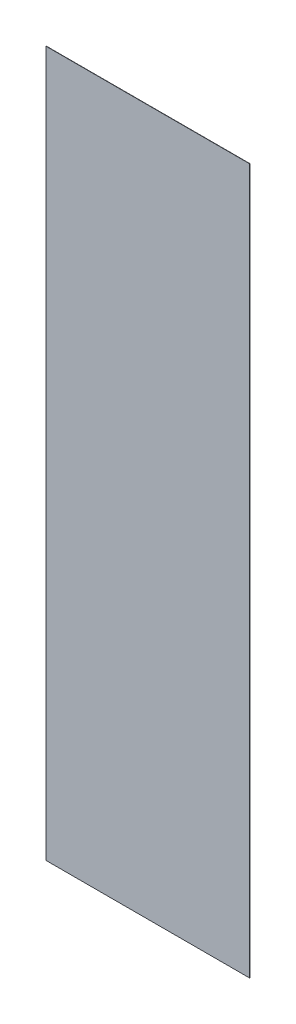
ISO-10303-21;
HEADER;
FILE_DESCRIPTION(('STEP AP214'),'2;1');
FILE_NAME('part.step','',(''),(''),'','','');
FILE_SCHEMA(('AUTOMOTIVE_DESIGN { 1 0 10303 214 1 1 1 1 }'));
ENDSEC;
DATA;
#1=APPLICATION_CONTEXT('core data for automotive mechanical design processes');
#2=APPLICATION_PROTOCOL_DEFINITION('international standard','automotive_design',2000,#1);
#3=PRODUCT_CONTEXT('',#1,'mechanical');
#4=PRODUCT('Part','Part','',(#3));
#5=PRODUCT_RELATED_PRODUCT_CATEGORY('part','',(#4));
#6=PRODUCT_DEFINITION_FORMATION('','',#4);
#7=PRODUCT_DEFINITION_CONTEXT('part definition',#1,'design');
#8=PRODUCT_DEFINITION('design','',#6,#7);
#9=PRODUCT_DEFINITION_SHAPE('','',#8);
#10=(LENGTH_UNIT() NAMED_UNIT(*) SI_UNIT(.MILLI.,.METRE.));
#11=(NAMED_UNIT(*) PLANE_ANGLE_UNIT() SI_UNIT($,.RADIAN.));
#12=(NAMED_UNIT(*) SI_UNIT($,.STERADIAN.) SOLID_ANGLE_UNIT());
#13=UNCERTAINTY_MEASURE_WITH_UNIT(LENGTH_MEASURE(1.E-05),#10,'distance_accuracy_value','');
#14=(GEOMETRIC_REPRESENTATION_CONTEXT(3) GLOBAL_UNCERTAINTY_ASSIGNED_CONTEXT((#13)) GLOBAL_UNIT_ASSIGNED_CONTEXT((#10,
#11,#12)) REPRESENTATION_CONTEXT('',''));
#15=CARTESIAN_POINT('',(0.,0.,0.));
#16=DIRECTION('',(0.,0.,1.));
#17=DIRECTION('',(1.,0.,0.));
#18=AXIS2_PLACEMENT_3D('',#15,#16,#17);
#19=CARTESIAN_POINT('',(693.76,-4810.,0.));
#20=DIRECTION('',(0.866025403784456,0.,0.499999999999969));
#21=DIRECTION('',(0.499999999999969,0.,-0.866025403784456));
#22=AXIS2_PLACEMENT_3D('',#19,#20,#21);
#23=PLANE('',#22);
#24=DIRECTION('',(0.,1.,0.));
#25=VECTOR('',#24,1.);
#26=CARTESIAN_POINT('',(694.33735026919,-4810.,-0.99999999999983));
#27=LINE('',#26,#25);
#28=CARTESIAN_POINT('',(694.33735026919,-4810.,-0.99999999999983));
#29=VERTEX_POINT('',#28);
#30=CARTESIAN_POINT('',(694.33735026919,0.,-0.99999999999983));
#31=VERTEX_POINT('',#30);
#32=EDGE_CURVE('E78',#29,#31,#27,.T.);
#33=ORIENTED_EDGE('',*,*,#32,.T.);
#34=DIRECTION('',(0.377964473009057,0.654653670708317,-0.654653670707736));
#35=VECTOR('',#34,1.);
#36=CARTESIAN_POINT('',(-496.1589047999,-2062.00000000214,2061.00000000031));
#37=LINE('',#36,#35);
#38=CARTESIAN_POINT('',(693.76,-1.00000000000033,0.));
#39=VERTEX_POINT('',#38);
#40=EDGE_CURVE('E61',#31,#39,#37,.F.);
#41=ORIENTED_EDGE('',*,*,#40,.T.);
#42=DIRECTION('',(0.,1.,0.));
#43=VECTOR('',#42,1.);
#44=CARTESIAN_POINT('',(693.76,-4810.,0.));
#45=LINE('',#44,#43);
#46=CARTESIAN_POINT('',(693.76,-4810.,0.));
#47=VERTEX_POINT('',#46);
#48=EDGE_CURVE('E99',#47,#39,#45,.T.);
#49=ORIENTED_EDGE('',*,*,#48,.F.);
#50=DIRECTION('',(0.499999999999969,0.,-0.866025403784456));
#51=VECTOR('',#50,1.);
#52=CARTESIAN_POINT('',(693.76,-4810.,0.));
#53=LINE('',#52,#51);
#54=EDGE_CURVE('E94',#47,#29,#53,.T.);
#55=ORIENTED_EDGE('',*,*,#54,.T.);
#56=EDGE_LOOP('',(#33,#41,#49,#55));
#57=FACE_BOUND('',#56,.T.);
#58=ADVANCED_FACE('F38',(#57),#23,.T.);
#59=CARTESIAN_POINT('',(-693.76,-4810.,0.));
#60=DIRECTION('',(0.,0.,1.));
#61=DIRECTION('',(1.,0.,0.));
#62=AXIS2_PLACEMENT_3D('',#59,#60,#61);
#63=PLANE('',#62);
#64=ORIENTED_EDGE('',*,*,#48,.T.);
#65=DIRECTION('',(-1.,0.,0.));
#66=VECTOR('',#65,1.);
#67=CARTESIAN_POINT('',(-693.76,-1.00000000000033,0.));
#68=LINE('',#67,#66);
#69=CARTESIAN_POINT('',(-693.76,-1.00000000000033,0.));
#70=VERTEX_POINT('',#69);
#71=EDGE_CURVE('E47',#39,#70,#68,.T.);
#72=ORIENTED_EDGE('',*,*,#71,.T.);
#73=DIRECTION('',(0.,1.,0.));
#74=VECTOR('',#73,1.);
#75=CARTESIAN_POINT('',(-693.76,-4810.,0.));
#76=LINE('',#75,#74);
#77=CARTESIAN_POINT('',(-693.76,-4810.,0.));
#78=VERTEX_POINT('',#77);
#79=EDGE_CURVE('E106',#78,#70,#76,.T.);
#80=ORIENTED_EDGE('',*,*,#79,.F.);
#81=DIRECTION('',(1.,0.,0.));
#82=VECTOR('',#81,1.);
#83=CARTESIAN_POINT('',(-693.76,-4810.,0.));
#84=LINE('',#83,#82);
#85=EDGE_CURVE('E87',#78,#47,#84,.T.);
#86=ORIENTED_EDGE('',*,*,#85,.T.);
#87=EDGE_LOOP('',(#64,#72,#80,#86));
#88=FACE_BOUND('',#87,.T.);
#89=ADVANCED_FACE('F113',(#88),#63,.T.);
#90=CARTESIAN_POINT('',(-693.76,-4810.,0.));
#91=DIRECTION('',(-0.866025403784456,0.,0.499999999999969));
#92=DIRECTION('',(0.499999999999969,0.,0.866025403784456));
#93=AXIS2_PLACEMENT_3D('',#90,#91,#92);
#94=PLANE('',#93);
#95=ORIENTED_EDGE('',*,*,#79,.T.);
#96=DIRECTION('',(0.377964473009057,-0.654653670708317,0.654653670707736));
#97=VECTOR('',#96,1.);
#98=CARTESIAN_POINT('',(496.1589047999,-2062.00000000214,2061.00000000031));
#99=LINE('',#98,#97);
#100=CARTESIAN_POINT('',(-694.33735026919,0.,-0.99999999999983));
#101=VERTEX_POINT('',#100);
#102=EDGE_CURVE('E11',#70,#101,#99,.F.);
#103=ORIENTED_EDGE('',*,*,#102,.T.);
#104=DIRECTION('',(0.,1.,0.));
#105=VECTOR('',#104,1.);
#106=CARTESIAN_POINT('',(-694.33735026919,-4810.,-0.99999999999983));
#107=LINE('',#106,#105);
#108=CARTESIAN_POINT('',(-694.33735026919,-4810.,-0.99999999999983));
#109=VERTEX_POINT('',#108);
#110=EDGE_CURVE('E86',#109,#101,#107,.T.);
#111=ORIENTED_EDGE('',*,*,#110,.F.);
#112=DIRECTION('',(0.499999999999969,0.,0.866025403784456));
#113=VECTOR('',#112,1.);
#114=CARTESIAN_POINT('',(-693.76,-4810.,0.));
#115=LINE('',#114,#113);
#116=EDGE_CURVE('E97',#109,#78,#115,.T.);
#117=ORIENTED_EDGE('',*,*,#116,.T.);
#118=EDGE_LOOP('',(#95,#103,#111,#117));
#119=FACE_BOUND('',#118,.T.);
#120=ADVANCED_FACE('F112',(#119),#94,.T.);
#121=CARTESIAN_POINT('',(694.33735026919,-4810.,-0.99999999999983));
#122=DIRECTION('',(0.,0.,-1.));
#123=DIRECTION('',(-1.,0.,0.));
#124=AXIS2_PLACEMENT_3D('',#121,#122,#123);
#125=PLANE('',#124);
#126=DIRECTION('',(-1.,0.,0.));
#127=VECTOR('',#126,1.);
#128=CARTESIAN_POINT('',(694.33735026919,0.,-0.99999999999983));
#129=LINE('',#128,#127);
#130=EDGE_CURVE('E84',#31,#101,#129,.T.);
#131=ORIENTED_EDGE('',*,*,#130,.F.);
#132=ORIENTED_EDGE('',*,*,#32,.F.);
#133=DIRECTION('',(-1.,0.,0.));
#134=VECTOR('',#133,1.);
#135=CARTESIAN_POINT('',(694.33735026919,-4810.,-0.99999999999983));
#136=LINE('',#135,#134);
#137=EDGE_CURVE('E82',#29,#109,#136,.T.);
#138=ORIENTED_EDGE('',*,*,#137,.T.);
#139=ORIENTED_EDGE('',*,*,#110,.T.);
#140=EDGE_LOOP('',(#131,#132,#138,#139));
#141=FACE_BOUND('',#140,.T.);
#142=ADVANCED_FACE('F80',(#141),#125,.T.);
#143=CARTESIAN_POINT('',(0.,-4810.,0.));
#144=DIRECTION('',(0.,1.,0.));
#145=DIRECTION('',(0.,0.,1.));
#146=AXIS2_PLACEMENT_3D('',#143,#144,#145);
#147=PLANE('',#146);
#148=ORIENTED_EDGE('',*,*,#54,.F.);
#149=ORIENTED_EDGE('',*,*,#85,.F.);
#150=ORIENTED_EDGE('',*,*,#116,.F.);
#151=ORIENTED_EDGE('',*,*,#137,.F.);
#152=EDGE_LOOP('',(#148,#149,#150,#151));
#153=FACE_BOUND('',#152,.T.);
#154=ADVANCED_FACE('F92',(#153),#147,.F.);
#155=CARTESIAN_POINT('',(0.,0.,-0.999999999999446));
#156=DIRECTION('',(0.,-0.707106781186233,-0.707106781186862));
#157=DIRECTION('',(1.,0.,0.));
#158=AXIS2_PLACEMENT_3D('',#155,#156,#157);
#159=PLANE('',#158);
#160=ORIENTED_EDGE('',*,*,#102,.F.);
#161=ORIENTED_EDGE('',*,*,#71,.F.);
#162=ORIENTED_EDGE('',*,*,#40,.F.);
#163=ORIENTED_EDGE('',*,*,#130,.T.);
#164=EDGE_LOOP('',(#160,#161,#162,#163));
#165=FACE_BOUND('',#164,.T.);
#166=ADVANCED_FACE('F41',(#165),#159,.F.);
#167=CLOSED_SHELL('',(#58,#89,#120,#142,#154,#166));
#168=MANIFOLD_SOLID_BREP('B2',#167);
#169=ADVANCED_BREP_SHAPE_REPRESENTATION('',(#18,#168),#14);
#170=SHAPE_DEFINITION_REPRESENTATION(#9,#169);
ENDSEC;
END-ISO-10303-21;
